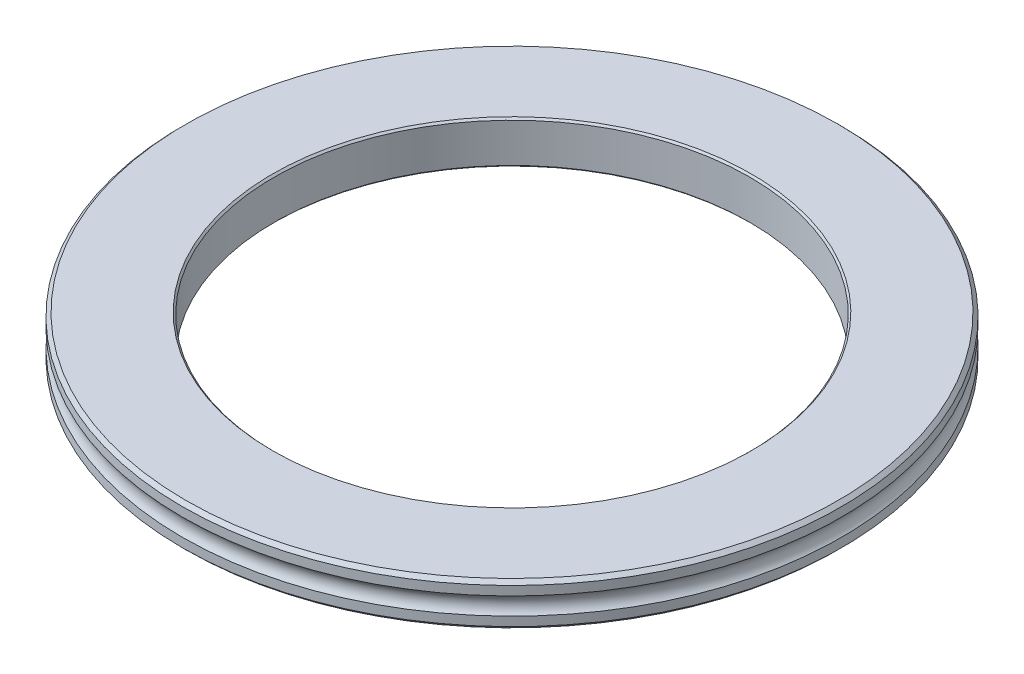
ISO-10303-21;
HEADER;
FILE_DESCRIPTION(('STEP AP214'),'2;1');
FILE_NAME('part.step','',(''),(''),'','','');
FILE_SCHEMA(('AUTOMOTIVE_DESIGN { 1 0 10303 214 1 1 1 1 }'));
ENDSEC;
DATA;
#1=APPLICATION_CONTEXT('core data for automotive mechanical design processes');
#2=APPLICATION_PROTOCOL_DEFINITION('international standard','automotive_design',2000,#1);
#3=PRODUCT_CONTEXT('',#1,'mechanical');
#4=PRODUCT('Part','Part','',(#3));
#5=PRODUCT_RELATED_PRODUCT_CATEGORY('part','',(#4));
#6=PRODUCT_DEFINITION_FORMATION('','',#4);
#7=PRODUCT_DEFINITION_CONTEXT('part definition',#1,'design');
#8=PRODUCT_DEFINITION('design','',#6,#7);
#9=PRODUCT_DEFINITION_SHAPE('','',#8);
#10=(LENGTH_UNIT() NAMED_UNIT(*) SI_UNIT(.MILLI.,.METRE.));
#11=(NAMED_UNIT(*) PLANE_ANGLE_UNIT() SI_UNIT($,.RADIAN.));
#12=(NAMED_UNIT(*) SI_UNIT($,.STERADIAN.) SOLID_ANGLE_UNIT());
#13=UNCERTAINTY_MEASURE_WITH_UNIT(LENGTH_MEASURE(1.E-05),#10,'distance_accuracy_value','');
#14=(GEOMETRIC_REPRESENTATION_CONTEXT(3) GLOBAL_UNCERTAINTY_ASSIGNED_CONTEXT((#13)) GLOBAL_UNIT_ASSIGNED_CONTEXT((#10,
#11,#12)) REPRESENTATION_CONTEXT('',''));
#15=CARTESIAN_POINT('',(0.,0.,0.));
#16=DIRECTION('',(0.,0.,1.));
#17=DIRECTION('',(1.,0.,0.));
#18=AXIS2_PLACEMENT_3D('',#15,#16,#17);
#19=CARTESIAN_POINT('',(0.,6.,0.));
#20=DIRECTION('',(0.,-1.,0.));
#21=DIRECTION('',(0.,0.,-1.));
#22=AXIS2_PLACEMENT_3D('',#19,#20,#21);
#23=CYLINDRICAL_SURFACE('',#22,92.5);
#24=CARTESIAN_POINT('',(0.,4.99999999910269,0.));
#25=DIRECTION('',(0.,1.,0.));
#26=DIRECTION('',(0.,0.,1.));
#27=AXIS2_PLACEMENT_3D('',#24,#25,#26);
#28=CIRCLE('',#27,92.5);
#29=CARTESIAN_POINT('',(0.,4.99999999910269,92.5));
#30=VERTEX_POINT('',#29);
#31=EDGE_CURVE('E53',#30,#30,#28,.F.);
#32=ORIENTED_EDGE('',*,*,#31,.T.);
#33=EDGE_LOOP('',(#32));
#34=FACE_BOUND('',#33,.T.);
#35=CARTESIAN_POINT('',(0.,2.44948974278304,0.));
#36=DIRECTION('',(0.,-1.,0.));
#37=DIRECTION('',(0.,0.,-1.));
#38=AXIS2_PLACEMENT_3D('',#35,#36,#37);
#39=CIRCLE('',#38,92.5);
#40=CARTESIAN_POINT('',(0.,2.44948974278304,-92.5));
#41=VERTEX_POINT('',#40);
#42=EDGE_CURVE('E70',#41,#41,#39,.T.);
#43=ORIENTED_EDGE('',*,*,#42,.F.);
#44=EDGE_LOOP('',(#43));
#45=FACE_BOUND('',#44,.T.);
#46=ADVANCED_FACE('F37',(#34,#45),#23,.T.);
#47=CARTESIAN_POINT('',(0.,0.,0.));
#48=DIRECTION('',(0.,-1.,0.));
#49=DIRECTION('',(0.,0.,-1.));
#50=AXIS2_PLACEMENT_3D('',#47,#48,#49);
#51=TOROIDAL_SURFACE('',#50,95.,3.49999999999992);
#52=ORIENTED_EDGE('',*,*,#42,.T.);
#53=EDGE_LOOP('',(#52));
#54=FACE_BOUND('',#53,.T.);
#55=CARTESIAN_POINT('',(0.,-2.44948974278308,0.));
#56=DIRECTION('',(0.,-1.,0.));
#57=DIRECTION('',(0.,0.,-1.));
#58=AXIS2_PLACEMENT_3D('',#55,#56,#57);
#59=CIRCLE('',#58,92.5);
#60=CARTESIAN_POINT('',(0.,-2.44948974278308,-92.5));
#61=VERTEX_POINT('',#60);
#62=EDGE_CURVE('E73',#61,#61,#59,.T.);
#63=ORIENTED_EDGE('',*,*,#62,.F.);
#64=EDGE_LOOP('',(#63));
#65=FACE_BOUND('',#64,.T.);
#66=ADVANCED_FACE('F79',(#54,#65),#51,.F.);
#67=CARTESIAN_POINT('',(0.,6.,0.));
#68=DIRECTION('',(0.,-1.,0.));
#69=DIRECTION('',(0.,0.,-1.));
#70=AXIS2_PLACEMENT_3D('',#67,#68,#69);
#71=CYLINDRICAL_SURFACE('',#70,92.5);
#72=CARTESIAN_POINT('',(0.,-5.00000000089764,0.));
#73=DIRECTION('',(0.,-1.,0.));
#74=DIRECTION('',(0.,0.,-1.));
#75=AXIS2_PLACEMENT_3D('',#72,#73,#74);
#76=CIRCLE('',#75,92.5);
#77=CARTESIAN_POINT('',(0.,-5.00000000089764,-92.5));
#78=VERTEX_POINT('',#77);
#79=EDGE_CURVE('E10',#78,#78,#76,.F.);
#80=ORIENTED_EDGE('',*,*,#79,.T.);
#81=EDGE_LOOP('',(#80));
#82=FACE_BOUND('',#81,.T.);
#83=ORIENTED_EDGE('',*,*,#62,.T.);
#84=EDGE_LOOP('',(#83));
#85=FACE_BOUND('',#84,.T.);
#86=ADVANCED_FACE('F77',(#82,#85),#71,.T.);
#87=CARTESIAN_POINT('',(0.,-6.,0.));
#88=DIRECTION('',(0.,-1.,0.));
#89=DIRECTION('',(0.,0.,-1.));
#90=AXIS2_PLACEMENT_3D('',#87,#88,#89);
#91=PLANE('',#90);
#92=CARTESIAN_POINT('',(0.,-6.,0.));
#93=DIRECTION('',(0.,-1.,0.));
#94=DIRECTION('',(0.,0.,-1.));
#95=AXIS2_PLACEMENT_3D('',#92,#93,#94);
#96=CIRCLE('',#95,91.4999999991027);
#97=CARTESIAN_POINT('',(0.,-6.,-91.4999999991027));
#98=VERTEX_POINT('',#97);
#99=EDGE_CURVE('E45',#98,#98,#96,.T.);
#100=ORIENTED_EDGE('',*,*,#99,.T.);
#101=EDGE_LOOP('',(#100));
#102=FACE_BOUND('',#101,.T.);
#103=CARTESIAN_POINT('',(0.,-6.,0.));
#104=DIRECTION('',(0.,-1.,0.));
#105=DIRECTION('',(0.,0.,-1.));
#106=AXIS2_PLACEMENT_3D('',#103,#104,#105);
#107=CIRCLE('',#106,67.2499999995512);
#108=CARTESIAN_POINT('',(0.,-6.,-67.2499999995512));
#109=VERTEX_POINT('',#108);
#110=EDGE_CURVE('E58',#109,#109,#107,.F.);
#111=ORIENTED_EDGE('',*,*,#110,.T.);
#112=EDGE_LOOP('',(#111));
#113=FACE_BOUND('',#112,.T.);
#114=ADVANCED_FACE('F87',(#102,#113),#91,.T.);
#115=CARTESIAN_POINT('',(92.5,6.,0.));
#116=DIRECTION('',(0.,1.,0.));
#117=DIRECTION('',(0.,0.,1.));
#118=AXIS2_PLACEMENT_3D('',#115,#116,#117);
#119=PLANE('',#118);
#120=CARTESIAN_POINT('',(0.,6.,0.));
#121=DIRECTION('',(0.,1.,0.));
#122=DIRECTION('',(0.,0.,1.));
#123=AXIS2_PLACEMENT_3D('',#120,#121,#122);
#124=CIRCLE('',#123,91.5000000008975);
#125=CARTESIAN_POINT('',(0.,6.,91.5000000008975));
#126=VERTEX_POINT('',#125);
#127=EDGE_CURVE('E49',#126,#126,#124,.T.);
#128=ORIENTED_EDGE('',*,*,#127,.T.);
#129=EDGE_LOOP('',(#128));
#130=FACE_BOUND('',#129,.T.);
#131=CARTESIAN_POINT('',(0.,6.,0.));
#132=DIRECTION('',(0.,1.,0.));
#133=DIRECTION('',(0.,0.,1.));
#134=AXIS2_PLACEMENT_3D('',#131,#132,#133);
#135=CIRCLE('',#134,67.2500000004487);
#136=CARTESIAN_POINT('',(0.,6.,67.2500000004487));
#137=VERTEX_POINT('',#136);
#138=EDGE_CURVE('E67',#137,#137,#135,.F.);
#139=ORIENTED_EDGE('',*,*,#138,.T.);
#140=EDGE_LOOP('',(#139));
#141=FACE_BOUND('',#140,.T.);
#142=ADVANCED_FACE('F123',(#130,#141),#119,.T.);
#143=CARTESIAN_POINT('',(0.,-6.,0.));
#144=DIRECTION('',(0.,-1.,0.));
#145=DIRECTION('',(0.,0.,-1.));
#146=AXIS2_PLACEMENT_3D('',#143,#144,#145);
#147=CYLINDRICAL_SURFACE('',#146,66.75);
#148=CARTESIAN_POINT('',(0.,5.50000000044881,0.));
#149=DIRECTION('',(0.,1.,0.));
#150=DIRECTION('',(0.,0.,1.));
#151=AXIS2_PLACEMENT_3D('',#148,#149,#150);
#152=CIRCLE('',#151,66.75);
#153=CARTESIAN_POINT('',(0.,5.50000000044881,66.75));
#154=VERTEX_POINT('',#153);
#155=EDGE_CURVE('E61',#154,#154,#152,.T.);
#156=ORIENTED_EDGE('',*,*,#155,.T.);
#157=EDGE_LOOP('',(#156));
#158=FACE_BOUND('',#157,.T.);
#159=CARTESIAN_POINT('',(0.,-5.49999999955137,0.));
#160=DIRECTION('',(0.,-1.,0.));
#161=DIRECTION('',(0.,0.,-1.));
#162=AXIS2_PLACEMENT_3D('',#159,#160,#161);
#163=CIRCLE('',#162,66.75);
#164=CARTESIAN_POINT('',(0.,-5.49999999955137,-66.75));
#165=VERTEX_POINT('',#164);
#166=EDGE_CURVE('E64',#165,#165,#163,.T.);
#167=ORIENTED_EDGE('',*,*,#166,.T.);
#168=EDGE_LOOP('',(#167));
#169=FACE_BOUND('',#168,.T.);
#170=ADVANCED_FACE('F101',(#158,#169),#147,.F.);
#171=CARTESIAN_POINT('',(0.,6.,0.));
#172=DIRECTION('',(0.,1.,0.));
#173=DIRECTION('',(0.,0.,1.));
#174=AXIS2_PLACEMENT_3D('',#171,#172,#173);
#175=CONICAL_SURFACE('',#174,67.2500000004487,0.785398164294883);
#176=ORIENTED_EDGE('',*,*,#155,.F.);
#177=EDGE_LOOP('',(#176));
#178=FACE_BOUND('',#177,.T.);
#179=ORIENTED_EDGE('',*,*,#138,.F.);
#180=EDGE_LOOP('',(#179));
#181=FACE_BOUND('',#180,.T.);
#182=ADVANCED_FACE('F94',(#178,#181),#175,.F.);
#183=CARTESIAN_POINT('',(0.,-5.49999999955137,0.));
#184=DIRECTION('',(0.,-1.,0.));
#185=DIRECTION('',(0.,0.,-1.));
#186=AXIS2_PLACEMENT_3D('',#183,#184,#185);
#187=CONICAL_SURFACE('',#186,66.75,0.785398162500027);
#188=ORIENTED_EDGE('',*,*,#110,.F.);
#189=EDGE_LOOP('',(#188));
#190=FACE_BOUND('',#189,.T.);
#191=ORIENTED_EDGE('',*,*,#166,.F.);
#192=EDGE_LOOP('',(#191));
#193=FACE_BOUND('',#192,.T.);
#194=ADVANCED_FACE('F100',(#190,#193),#187,.F.);
#195=CARTESIAN_POINT('',(0.,4.99999999910269,0.));
#196=DIRECTION('',(0.,-1.,0.));
#197=DIRECTION('',(0.,0.,-1.));
#198=AXIS2_PLACEMENT_3D('',#195,#196,#197);
#199=CONICAL_SURFACE('',#198,92.5,0.785398162500006);
#200=ORIENTED_EDGE('',*,*,#127,.F.);
#201=EDGE_LOOP('',(#200));
#202=FACE_BOUND('',#201,.T.);
#203=ORIENTED_EDGE('',*,*,#31,.F.);
#204=EDGE_LOOP('',(#203));
#205=FACE_BOUND('',#204,.T.);
#206=ADVANCED_FACE('F107',(#202,#205),#199,.T.);
#207=CARTESIAN_POINT('',(0.,-6.,0.));
#208=DIRECTION('',(0.,1.,0.));
#209=DIRECTION('',(0.,0.,1.));
#210=AXIS2_PLACEMENT_3D('',#207,#208,#209);
#211=CONICAL_SURFACE('',#210,91.4999999991027,0.785398164294904);
#212=ORIENTED_EDGE('',*,*,#79,.F.);
#213=EDGE_LOOP('',(#212));
#214=FACE_BOUND('',#213,.T.);
#215=ORIENTED_EDGE('',*,*,#99,.F.);
#216=EDGE_LOOP('',(#215));
#217=FACE_BOUND('',#216,.T.);
#218=ADVANCED_FACE('F40',(#214,#217),#211,.T.);
#219=CLOSED_SHELL('',(#46,#66,#86,#114,#142,#170,#182,#194,#206,#218));
#220=MANIFOLD_SOLID_BREP('B2',#219);
#221=ADVANCED_BREP_SHAPE_REPRESENTATION('',(#18,#220),#14);
#222=SHAPE_DEFINITION_REPRESENTATION(#9,#221);
ENDSEC;
END-ISO-10303-21;
